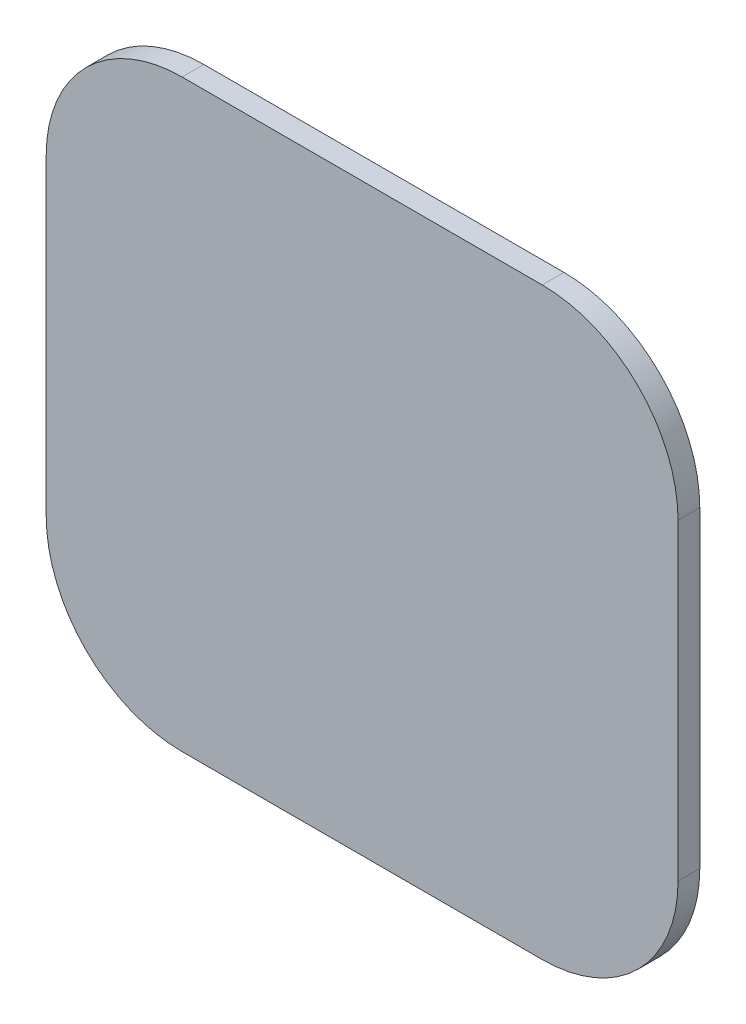
ISO-10303-21;
HEADER;
FILE_DESCRIPTION(('STEP AP214'),'2;1');
FILE_NAME('part.step','',(''),(''),'','','');
FILE_SCHEMA(('AUTOMOTIVE_DESIGN { 1 0 10303 214 1 1 1 1 }'));
ENDSEC;
DATA;
#1=APPLICATION_CONTEXT('core data for automotive mechanical design processes');
#2=APPLICATION_PROTOCOL_DEFINITION('international standard','automotive_design',2000,#1);
#3=PRODUCT_CONTEXT('',#1,'mechanical');
#4=PRODUCT('Part','Part','',(#3));
#5=PRODUCT_RELATED_PRODUCT_CATEGORY('part','',(#4));
#6=PRODUCT_DEFINITION_FORMATION('','',#4);
#7=PRODUCT_DEFINITION_CONTEXT('part definition',#1,'design');
#8=PRODUCT_DEFINITION('design','',#6,#7);
#9=PRODUCT_DEFINITION_SHAPE('','',#8);
#10=(LENGTH_UNIT() NAMED_UNIT(*) SI_UNIT(.MILLI.,.METRE.));
#11=(NAMED_UNIT(*) PLANE_ANGLE_UNIT() SI_UNIT($,.RADIAN.));
#12=(NAMED_UNIT(*) SI_UNIT($,.STERADIAN.) SOLID_ANGLE_UNIT());
#13=UNCERTAINTY_MEASURE_WITH_UNIT(LENGTH_MEASURE(1.E-05),#10,'distance_accuracy_value','');
#14=(GEOMETRIC_REPRESENTATION_CONTEXT(3) GLOBAL_UNCERTAINTY_ASSIGNED_CONTEXT((#13)) GLOBAL_UNIT_ASSIGNED_CONTEXT((#10,
#11,#12)) REPRESENTATION_CONTEXT('',''));
#15=CARTESIAN_POINT('',(0.,0.,0.));
#16=DIRECTION('',(0.,0.,1.));
#17=DIRECTION('',(1.,0.,0.));
#18=AXIS2_PLACEMENT_3D('',#15,#16,#17);
#19=CARTESIAN_POINT('',(-36.5,33.,1.6));
#20=DIRECTION('',(0.,0.,-1.));
#21=DIRECTION('',(-1.,0.,0.));
#22=AXIS2_PLACEMENT_3D('',#19,#20,#21);
#23=CYLINDRICAL_SURFACE('',#22,10.);
#24=CARTESIAN_POINT('',(-36.5,33.,0.));
#25=DIRECTION('',(0.,0.,1.));
#26=DIRECTION('',(1.,0.,0.));
#27=AXIS2_PLACEMENT_3D('',#24,#25,#26);
#28=CIRCLE('',#27,10.);
#29=CARTESIAN_POINT('',(-36.4999999999999,43.,0.));
#30=VERTEX_POINT('',#29);
#31=CARTESIAN_POINT('',(-46.5,32.9999999999999,0.));
#32=VERTEX_POINT('',#31);
#33=EDGE_CURVE('E129',#30,#32,#28,.T.);
#34=ORIENTED_EDGE('',*,*,#33,.T.);
#35=DIRECTION('',(0.,0.,-1.));
#36=VECTOR('',#35,1.);
#37=CARTESIAN_POINT('',(-46.5,32.9999999999999,1.6));
#38=LINE('',#37,#36);
#39=CARTESIAN_POINT('',(-46.5,32.9999999999999,1.6));
#40=VERTEX_POINT('',#39);
#41=EDGE_CURVE('E11',#40,#32,#38,.T.);
#42=ORIENTED_EDGE('',*,*,#41,.F.);
#43=CARTESIAN_POINT('',(-36.5,33.,1.6));
#44=DIRECTION('',(0.,0.,1.));
#45=DIRECTION('',(1.,0.,0.));
#46=AXIS2_PLACEMENT_3D('',#43,#44,#45);
#47=CIRCLE('',#46,10.);
#48=CARTESIAN_POINT('',(-36.4999999999999,43.,1.6));
#49=VERTEX_POINT('',#48);
#50=EDGE_CURVE('E143',#49,#40,#47,.T.);
#51=ORIENTED_EDGE('',*,*,#50,.F.);
#52=DIRECTION('',(0.,0.,-1.));
#53=VECTOR('',#52,1.);
#54=CARTESIAN_POINT('',(-36.4999999999999,43.,1.6));
#55=LINE('',#54,#53);
#56=EDGE_CURVE('E125',#49,#30,#55,.T.);
#57=ORIENTED_EDGE('',*,*,#56,.T.);
#58=EDGE_LOOP('',(#34,#42,#51,#57));
#59=FACE_BOUND('',#58,.T.);
#60=ADVANCED_FACE('F33',(#59),#23,.T.);
#61=CARTESIAN_POINT('',(-46.5,10.0000000000001,1.6));
#62=DIRECTION('',(1.,0.,0.));
#63=DIRECTION('',(0.,0.,-1.));
#64=AXIS2_PLACEMENT_3D('',#61,#62,#63);
#65=PLANE('',#64);
#66=DIRECTION('',(0.,-1.,0.));
#67=VECTOR('',#66,1.);
#68=CARTESIAN_POINT('',(-46.5,10.0000000000001,0.));
#69=LINE('',#68,#67);
#70=CARTESIAN_POINT('',(-46.5,9.99999999999999,0.));
#71=VERTEX_POINT('',#70);
#72=EDGE_CURVE('E132',#32,#71,#69,.T.);
#73=ORIENTED_EDGE('',*,*,#72,.T.);
#74=DIRECTION('',(0.,0.,-1.));
#75=VECTOR('',#74,1.);
#76=CARTESIAN_POINT('',(-46.5,9.99999999999999,1.6));
#77=LINE('',#76,#75);
#78=CARTESIAN_POINT('',(-46.5,9.99999999999999,1.6));
#79=VERTEX_POINT('',#78);
#80=EDGE_CURVE('E41',#79,#71,#77,.T.);
#81=ORIENTED_EDGE('',*,*,#80,.F.);
#82=DIRECTION('',(0.,-1.,0.));
#83=VECTOR('',#82,1.);
#84=CARTESIAN_POINT('',(-46.5,10.0000000000001,1.6));
#85=LINE('',#84,#83);
#86=EDGE_CURVE('E92',#40,#79,#85,.T.);
#87=ORIENTED_EDGE('',*,*,#86,.F.);
#88=ORIENTED_EDGE('',*,*,#41,.T.);
#89=EDGE_LOOP('',(#73,#81,#87,#88));
#90=FACE_BOUND('',#89,.T.);
#91=ADVANCED_FACE('F178',(#90),#65,.F.);
#92=CARTESIAN_POINT('',(-36.5,9.99999999999999,1.6));
#93=DIRECTION('',(0.,0.,-1.));
#94=DIRECTION('',(-1.,0.,0.));
#95=AXIS2_PLACEMENT_3D('',#92,#93,#94);
#96=CYLINDRICAL_SURFACE('',#95,10.);
#97=CARTESIAN_POINT('',(-36.5,9.99999999999999,0.));
#98=DIRECTION('',(0.,0.,1.));
#99=DIRECTION('',(-1.,0.,0.));
#100=AXIS2_PLACEMENT_3D('',#97,#98,#99);
#101=CIRCLE('',#100,10.);
#102=CARTESIAN_POINT('',(-36.4999999999999,0.,0.));
#103=VERTEX_POINT('',#102);
#104=EDGE_CURVE('E134',#71,#103,#101,.T.);
#105=ORIENTED_EDGE('',*,*,#104,.T.);
#106=DIRECTION('',(0.,0.,-1.));
#107=VECTOR('',#106,1.);
#108=CARTESIAN_POINT('',(-36.4999999999999,0.,1.6));
#109=LINE('',#108,#107);
#110=CARTESIAN_POINT('',(-36.4999999999999,0.,1.6));
#111=VERTEX_POINT('',#110);
#112=EDGE_CURVE('E150',#111,#103,#109,.T.);
#113=ORIENTED_EDGE('',*,*,#112,.F.);
#114=CARTESIAN_POINT('',(-36.5,9.99999999999999,1.6));
#115=DIRECTION('',(0.,0.,1.));
#116=DIRECTION('',(-1.,0.,0.));
#117=AXIS2_PLACEMENT_3D('',#114,#115,#116);
#118=CIRCLE('',#117,10.);
#119=EDGE_CURVE('E158',#79,#111,#118,.T.);
#120=ORIENTED_EDGE('',*,*,#119,.F.);
#121=ORIENTED_EDGE('',*,*,#80,.T.);
#122=EDGE_LOOP('',(#105,#113,#120,#121));
#123=FACE_BOUND('',#122,.T.);
#124=ADVANCED_FACE('F156',(#123),#96,.T.);
#125=CARTESIAN_POINT('',(-10.0000000000001,0.,1.6));
#126=DIRECTION('',(0.,1.,0.));
#127=DIRECTION('',(-1.,0.,0.));
#128=AXIS2_PLACEMENT_3D('',#125,#126,#127);
#129=PLANE('',#128);
#130=DIRECTION('',(1.,0.,0.));
#131=VECTOR('',#130,1.);
#132=CARTESIAN_POINT('',(-10.0000000000001,0.,0.));
#133=LINE('',#132,#131);
#134=CARTESIAN_POINT('',(-10.0000000000001,0.,0.));
#135=VERTEX_POINT('',#134);
#136=EDGE_CURVE('E136',#103,#135,#133,.T.);
#137=ORIENTED_EDGE('',*,*,#136,.T.);
#138=DIRECTION('',(0.,0.,-1.));
#139=VECTOR('',#138,1.);
#140=CARTESIAN_POINT('',(-10.0000000000001,0.,1.6));
#141=LINE('',#140,#139);
#142=CARTESIAN_POINT('',(-10.0000000000001,0.,1.6));
#143=VERTEX_POINT('',#142);
#144=EDGE_CURVE('E147',#143,#135,#141,.T.);
#145=ORIENTED_EDGE('',*,*,#144,.F.);
#146=DIRECTION('',(1.,0.,0.));
#147=VECTOR('',#146,1.);
#148=CARTESIAN_POINT('',(-10.0000000000001,0.,1.6));
#149=LINE('',#148,#147);
#150=EDGE_CURVE('E170',#111,#143,#149,.T.);
#151=ORIENTED_EDGE('',*,*,#150,.F.);
#152=ORIENTED_EDGE('',*,*,#112,.T.);
#153=EDGE_LOOP('',(#137,#145,#151,#152));
#154=FACE_BOUND('',#153,.T.);
#155=ADVANCED_FACE('F166',(#154),#129,.F.);
#156=CARTESIAN_POINT('',(-10.,10.,1.6));
#157=DIRECTION('',(0.,0.,-1.));
#158=DIRECTION('',(-1.,0.,0.));
#159=AXIS2_PLACEMENT_3D('',#156,#157,#158);
#160=CYLINDRICAL_SURFACE('',#159,10.);
#161=CARTESIAN_POINT('',(-10.,10.,0.));
#162=DIRECTION('',(0.,0.,1.));
#163=DIRECTION('',(1.,0.,0.));
#164=AXIS2_PLACEMENT_3D('',#161,#162,#163);
#165=CIRCLE('',#164,10.);
#166=CARTESIAN_POINT('',(0.,10.0000000000001,0.));
#167=VERTEX_POINT('',#166);
#168=EDGE_CURVE('E138',#135,#167,#165,.T.);
#169=ORIENTED_EDGE('',*,*,#168,.T.);
#170=DIRECTION('',(0.,0.,-1.));
#171=VECTOR('',#170,1.);
#172=CARTESIAN_POINT('',(0.,10.0000000000001,1.6));
#173=LINE('',#172,#171);
#174=CARTESIAN_POINT('',(0.,10.0000000000001,1.6));
#175=VERTEX_POINT('',#174);
#176=EDGE_CURVE('E120',#175,#167,#173,.T.);
#177=ORIENTED_EDGE('',*,*,#176,.F.);
#178=CARTESIAN_POINT('',(-10.,10.,1.6));
#179=DIRECTION('',(0.,0.,1.));
#180=DIRECTION('',(1.,0.,0.));
#181=AXIS2_PLACEMENT_3D('',#178,#179,#180);
#182=CIRCLE('',#181,10.);
#183=EDGE_CURVE('E111',#143,#175,#182,.T.);
#184=ORIENTED_EDGE('',*,*,#183,.F.);
#185=ORIENTED_EDGE('',*,*,#144,.T.);
#186=EDGE_LOOP('',(#169,#177,#184,#185));
#187=FACE_BOUND('',#186,.T.);
#188=ADVANCED_FACE('F169',(#187),#160,.T.);
#189=CARTESIAN_POINT('',(0.,10.0000000000001,1.6));
#190=DIRECTION('',(-1.,0.,0.));
#191=DIRECTION('',(0.,0.,1.));
#192=AXIS2_PLACEMENT_3D('',#189,#190,#191);
#193=PLANE('',#192);
#194=DIRECTION('',(0.,1.,0.));
#195=VECTOR('',#194,1.);
#196=CARTESIAN_POINT('',(0.,10.0000000000001,0.));
#197=LINE('',#196,#195);
#198=CARTESIAN_POINT('',(0.,32.9999999999999,0.));
#199=VERTEX_POINT('',#198);
#200=EDGE_CURVE('E119',#167,#199,#197,.T.);
#201=ORIENTED_EDGE('',*,*,#200,.T.);
#202=DIRECTION('',(0.,0.,-1.));
#203=VECTOR('',#202,1.);
#204=CARTESIAN_POINT('',(0.,32.9999999999999,1.6));
#205=LINE('',#204,#203);
#206=CARTESIAN_POINT('',(0.,32.9999999999999,1.6));
#207=VERTEX_POINT('',#206);
#208=EDGE_CURVE('E116',#207,#199,#205,.T.);
#209=ORIENTED_EDGE('',*,*,#208,.F.);
#210=DIRECTION('',(0.,1.,0.));
#211=VECTOR('',#210,1.);
#212=CARTESIAN_POINT('',(0.,10.0000000000001,1.6));
#213=LINE('',#212,#211);
#214=EDGE_CURVE('E105',#175,#207,#213,.T.);
#215=ORIENTED_EDGE('',*,*,#214,.F.);
#216=ORIENTED_EDGE('',*,*,#176,.T.);
#217=EDGE_LOOP('',(#201,#209,#215,#216));
#218=FACE_BOUND('',#217,.T.);
#219=ADVANCED_FACE('F117',(#218),#193,.F.);
#220=CARTESIAN_POINT('',(-10.,33.,1.6));
#221=DIRECTION('',(0.,0.,-1.));
#222=DIRECTION('',(-1.,0.,0.));
#223=AXIS2_PLACEMENT_3D('',#220,#221,#222);
#224=CYLINDRICAL_SURFACE('',#223,10.);
#225=CARTESIAN_POINT('',(-10.,33.,0.));
#226=DIRECTION('',(0.,0.,1.));
#227=DIRECTION('',(1.,0.,0.));
#228=AXIS2_PLACEMENT_3D('',#225,#226,#227);
#229=CIRCLE('',#228,10.);
#230=CARTESIAN_POINT('',(-10.0000000000001,43.,0.));
#231=VERTEX_POINT('',#230);
#232=EDGE_CURVE('E78',#199,#231,#229,.T.);
#233=ORIENTED_EDGE('',*,*,#232,.T.);
#234=DIRECTION('',(0.,0.,-1.));
#235=VECTOR('',#234,1.);
#236=CARTESIAN_POINT('',(-10.0000000000001,43.,1.6));
#237=LINE('',#236,#235);
#238=CARTESIAN_POINT('',(-10.0000000000001,43.,1.6));
#239=VERTEX_POINT('',#238);
#240=EDGE_CURVE('E121',#239,#231,#237,.T.);
#241=ORIENTED_EDGE('',*,*,#240,.F.);
#242=CARTESIAN_POINT('',(-10.,33.,1.6));
#243=DIRECTION('',(0.,0.,1.));
#244=DIRECTION('',(1.,0.,0.));
#245=AXIS2_PLACEMENT_3D('',#242,#243,#244);
#246=CIRCLE('',#245,10.);
#247=EDGE_CURVE('E109',#207,#239,#246,.T.);
#248=ORIENTED_EDGE('',*,*,#247,.F.);
#249=ORIENTED_EDGE('',*,*,#208,.T.);
#250=EDGE_LOOP('',(#233,#241,#248,#249));
#251=FACE_BOUND('',#250,.T.);
#252=ADVANCED_FACE('F123',(#251),#224,.T.);
#253=CARTESIAN_POINT('',(-10.0000000000001,43.,1.6));
#254=DIRECTION('',(0.,-1.,0.));
#255=DIRECTION('',(1.,0.,0.));
#256=AXIS2_PLACEMENT_3D('',#253,#254,#255);
#257=PLANE('',#256);
#258=DIRECTION('',(-1.,0.,0.));
#259=VECTOR('',#258,1.);
#260=CARTESIAN_POINT('',(-10.0000000000001,43.,0.));
#261=LINE('',#260,#259);
#262=EDGE_CURVE('E84',#231,#30,#261,.T.);
#263=ORIENTED_EDGE('',*,*,#262,.T.);
#264=ORIENTED_EDGE('',*,*,#56,.F.);
#265=DIRECTION('',(-1.,0.,0.));
#266=VECTOR('',#265,1.);
#267=CARTESIAN_POINT('',(-10.0000000000001,43.,1.6));
#268=LINE('',#267,#266);
#269=EDGE_CURVE('E49',#239,#49,#268,.T.);
#270=ORIENTED_EDGE('',*,*,#269,.F.);
#271=ORIENTED_EDGE('',*,*,#240,.T.);
#272=EDGE_LOOP('',(#263,#264,#270,#271));
#273=FACE_BOUND('',#272,.T.);
#274=ADVANCED_FACE('F194',(#273),#257,.F.);
#275=CARTESIAN_POINT('',(-36.5,33.,1.6));
#276=DIRECTION('',(0.,0.,1.));
#277=DIRECTION('',(1.,0.,0.));
#278=AXIS2_PLACEMENT_3D('',#275,#276,#277);
#279=PLANE('',#278);
#280=ORIENTED_EDGE('',*,*,#50,.T.);
#281=ORIENTED_EDGE('',*,*,#86,.T.);
#282=ORIENTED_EDGE('',*,*,#119,.T.);
#283=ORIENTED_EDGE('',*,*,#150,.T.);
#284=ORIENTED_EDGE('',*,*,#183,.T.);
#285=ORIENTED_EDGE('',*,*,#214,.T.);
#286=ORIENTED_EDGE('',*,*,#247,.T.);
#287=ORIENTED_EDGE('',*,*,#269,.T.);
#288=EDGE_LOOP('',(#280,#281,#282,#283,#284,#285,#286,#287));
#289=FACE_BOUND('',#288,.T.);
#290=ADVANCED_FACE('F107',(#289),#279,.T.);
#291=CARTESIAN_POINT('',(-36.5,33.,0.));
#292=DIRECTION('',(0.,0.,1.));
#293=DIRECTION('',(1.,0.,0.));
#294=AXIS2_PLACEMENT_3D('',#291,#292,#293);
#295=PLANE('',#294);
#296=ORIENTED_EDGE('',*,*,#33,.F.);
#297=ORIENTED_EDGE('',*,*,#262,.F.);
#298=ORIENTED_EDGE('',*,*,#232,.F.);
#299=ORIENTED_EDGE('',*,*,#200,.F.);
#300=ORIENTED_EDGE('',*,*,#168,.F.);
#301=ORIENTED_EDGE('',*,*,#136,.F.);
#302=ORIENTED_EDGE('',*,*,#104,.F.);
#303=ORIENTED_EDGE('',*,*,#72,.F.);
#304=EDGE_LOOP('',(#296,#297,#298,#299,#300,#301,#302,#303));
#305=FACE_BOUND('',#304,.T.);
#306=ADVANCED_FACE('F162',(#305),#295,.F.);
#307=CLOSED_SHELL('',(#60,#91,#124,#155,#188,#219,#252,#274,#290,#306));
#308=MANIFOLD_SOLID_BREP('B2',#307);
#309=ADVANCED_BREP_SHAPE_REPRESENTATION('',(#18,#308),#14);
#310=SHAPE_DEFINITION_REPRESENTATION(#9,#309);
ENDSEC;
END-ISO-10303-21;
